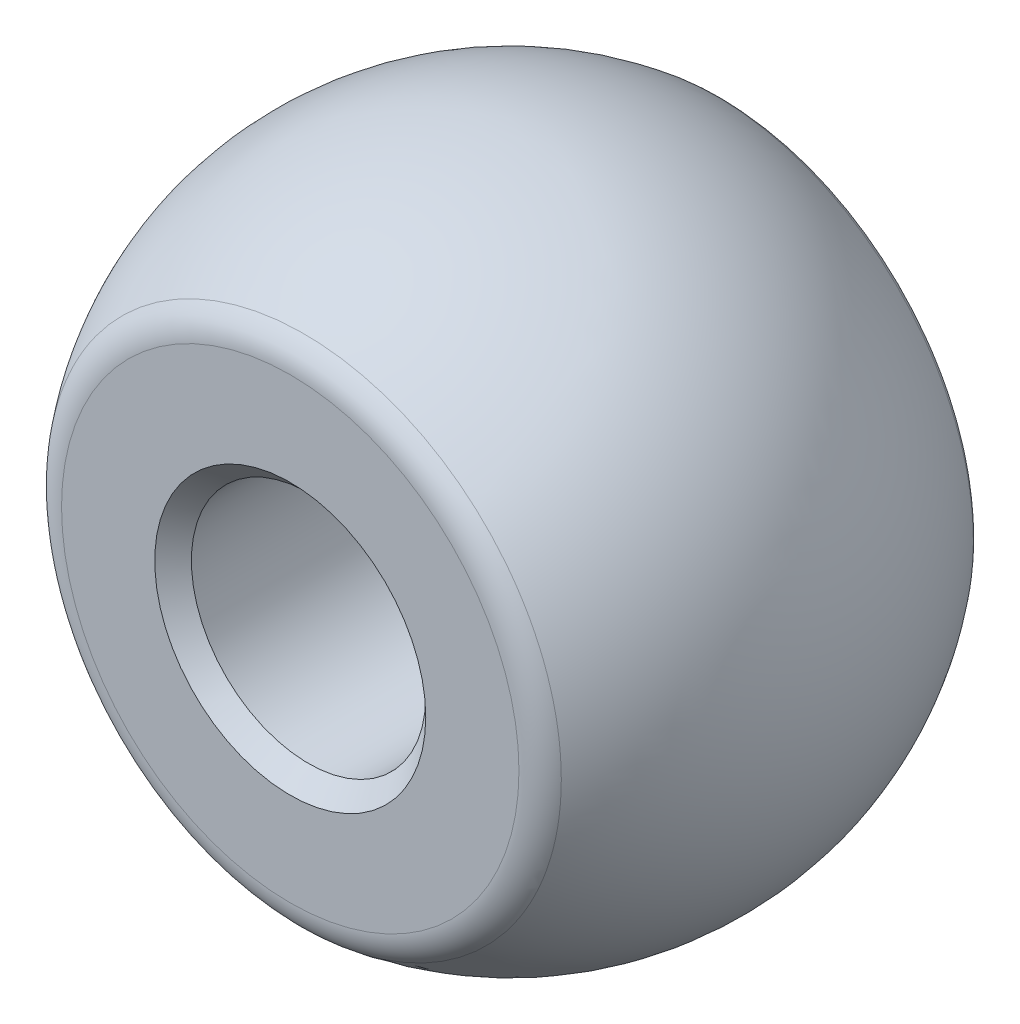
ISO-10303-21;
HEADER;
FILE_DESCRIPTION(('STEP AP214'),'2;1');
FILE_NAME('part.step','',(''),(''),'','','');
FILE_SCHEMA(('AUTOMOTIVE_DESIGN { 1 0 10303 214 1 1 1 1 }'));
ENDSEC;
DATA;
#1=APPLICATION_CONTEXT('core data for automotive mechanical design processes');
#2=APPLICATION_PROTOCOL_DEFINITION('international standard','automotive_design',2000,#1);
#3=PRODUCT_CONTEXT('',#1,'mechanical');
#4=PRODUCT('Part','Part','',(#3));
#5=PRODUCT_RELATED_PRODUCT_CATEGORY('part','',(#4));
#6=PRODUCT_DEFINITION_FORMATION('','',#4);
#7=PRODUCT_DEFINITION_CONTEXT('part definition',#1,'design');
#8=PRODUCT_DEFINITION('design','',#6,#7);
#9=PRODUCT_DEFINITION_SHAPE('','',#8);
#10=(LENGTH_UNIT() NAMED_UNIT(*) SI_UNIT(.MILLI.,.METRE.));
#11=(NAMED_UNIT(*) PLANE_ANGLE_UNIT() SI_UNIT($,.RADIAN.));
#12=(NAMED_UNIT(*) SI_UNIT($,.STERADIAN.) SOLID_ANGLE_UNIT());
#13=UNCERTAINTY_MEASURE_WITH_UNIT(LENGTH_MEASURE(1.E-05),#10,'distance_accuracy_value','');
#14=(GEOMETRIC_REPRESENTATION_CONTEXT(3) GLOBAL_UNCERTAINTY_ASSIGNED_CONTEXT((#13)) GLOBAL_UNIT_ASSIGNED_CONTEXT((#10,
#11,#12)) REPRESENTATION_CONTEXT('',''));
#15=CARTESIAN_POINT('',(0.,0.,0.));
#16=DIRECTION('',(0.,0.,1.));
#17=DIRECTION('',(1.,0.,0.));
#18=AXIS2_PLACEMENT_3D('',#15,#16,#17);
#19=CARTESIAN_POINT('',(0.,0.,-2.9999999999859));
#20=DIRECTION('',(0.,0.,-1.));
#21=DIRECTION('',(-1.,0.,0.));
#22=AXIS2_PLACEMENT_3D('',#19,#20,#21);
#23=CONICAL_SURFACE('',#22,1.84999999999036,0.785398163397448);
#24=CARTESIAN_POINT('',(0.,0.,-2.75));
#25=DIRECTION('',(0.,0.,1.));
#26=DIRECTION('',(1.,0.,0.));
#27=AXIS2_PLACEMENT_3D('',#24,#25,#26);
#28=CIRCLE('',#27,1.6);
#29=CARTESIAN_POINT('',(1.6,0.,-2.75));
#30=VERTEX_POINT('',#29);
#31=EDGE_CURVE('E145',#30,#30,#28,.T.);
#32=ORIENTED_EDGE('',*,*,#31,.T.);
#33=EDGE_LOOP('',(#32));
#34=FACE_BOUND('',#33,.T.);
#35=CARTESIAN_POINT('',(0.,0.,-2.9999999999859));
#36=DIRECTION('',(0.,0.,-1.));
#37=DIRECTION('',(-1.,0.,0.));
#38=AXIS2_PLACEMENT_3D('',#35,#36,#37);
#39=CIRCLE('',#38,1.84999999999036);
#40=CARTESIAN_POINT('',(-1.84999999999036,0.,-2.9999999999859));
#41=VERTEX_POINT('',#40);
#42=EDGE_CURVE('E144',#41,#41,#39,.F.);
#43=ORIENTED_EDGE('',*,*,#42,.F.);
#44=EDGE_LOOP('',(#43));
#45=FACE_BOUND('',#44,.T.);
#46=ADVANCED_FACE('F16',(#34,#45),#23,.F.);
#47=CARTESIAN_POINT('',(0.,0.,-4.5));
#48=DIRECTION('',(0.,0.,1.));
#49=DIRECTION('',(1.,0.,0.));
#50=AXIS2_PLACEMENT_3D('',#47,#48,#49);
#51=CYLINDRICAL_SURFACE('',#50,1.6);
#52=ORIENTED_EDGE('',*,*,#31,.F.);
#53=EDGE_LOOP('',(#52));
#54=FACE_BOUND('',#53,.T.);
#55=CARTESIAN_POINT('',(0.,0.,2.74999999999181));
#56=DIRECTION('',(0.,0.,1.));
#57=DIRECTION('',(1.,0.,0.));
#58=AXIS2_PLACEMENT_3D('',#55,#56,#57);
#59=CIRCLE('',#58,1.59999999999627);
#60=CARTESIAN_POINT('',(1.59999999999627,0.,2.74999999999181));
#61=VERTEX_POINT('',#60);
#62=EDGE_CURVE('E135',#61,#61,#59,.T.);
#63=ORIENTED_EDGE('',*,*,#62,.T.);
#64=EDGE_LOOP('',(#63));
#65=FACE_BOUND('',#64,.T.);
#66=ADVANCED_FACE('F119',(#54,#65),#51,.F.);
#67=CARTESIAN_POINT('',(0.,0.,-3.));
#68=DIRECTION('',(0.,0.,-1.));
#69=DIRECTION('',(-1.,0.,0.));
#70=AXIS2_PLACEMENT_3D('',#67,#68,#69);
#71=PLANE('',#70);
#72=ORIENTED_EDGE('',*,*,#42,.T.);
#73=EDGE_LOOP('',(#72));
#74=FACE_BOUND('',#73,.T.);
#75=CARTESIAN_POINT('',(0.,0.,-3.));
#76=DIRECTION('',(0.,0.,1.));
#77=DIRECTION('',(1.,0.,0.));
#78=AXIS2_PLACEMENT_3D('',#75,#76,#77);
#79=CIRCLE('',#78,3.1224989991992);
#80=CARTESIAN_POINT('',(3.1224989991992,0.,-3.));
#81=VERTEX_POINT('',#80);
#82=CARTESIAN_POINT('',(-3.1224989991992,0.,-3.));
#83=VERTEX_POINT('',#82);
#84=EDGE_CURVE('E104',#81,#83,#79,.T.);
#85=ORIENTED_EDGE('',*,*,#84,.F.);
#86=CARTESIAN_POINT('',(0.,0.,-3.));
#87=DIRECTION('',(0.,0.,1.));
#88=DIRECTION('',(-1.,0.,0.));
#89=AXIS2_PLACEMENT_3D('',#86,#87,#88);
#90=CIRCLE('',#89,3.1224989991992);
#91=EDGE_CURVE('E143',#83,#81,#90,.T.);
#92=ORIENTED_EDGE('',*,*,#91,.F.);
#93=EDGE_LOOP('',(#85,#92));
#94=FACE_BOUND('',#93,.T.);
#95=ADVANCED_FACE('F110',(#74,#94),#71,.T.);
#96=CARTESIAN_POINT('',(0.,0.,2.9999999999859));
#97=DIRECTION('',(0.,0.,1.));
#98=DIRECTION('',(1.,0.,0.));
#99=AXIS2_PLACEMENT_3D('',#96,#97,#98);
#100=CONICAL_SURFACE('',#99,1.8500000000472,0.785398163511135);
#101=ORIENTED_EDGE('',*,*,#62,.F.);
#102=EDGE_LOOP('',(#101));
#103=FACE_BOUND('',#102,.T.);
#104=CARTESIAN_POINT('',(0.,0.,2.9999999999859));
#105=DIRECTION('',(0.,0.,1.));
#106=DIRECTION('',(1.,0.,0.));
#107=AXIS2_PLACEMENT_3D('',#104,#105,#106);
#108=CIRCLE('',#107,1.8500000000472);
#109=CARTESIAN_POINT('',(1.8500000000472,0.,2.9999999999859));
#110=VERTEX_POINT('',#109);
#111=EDGE_CURVE('E150',#110,#110,#108,.F.);
#112=ORIENTED_EDGE('',*,*,#111,.F.);
#113=EDGE_LOOP('',(#112));
#114=FACE_BOUND('',#113,.T.);
#115=ADVANCED_FACE('F118',(#103,#114),#100,.F.);
#116=CARTESIAN_POINT('',(0.,0.,-2.5));
#117=DIRECTION('',(0.,0.,-1.));
#118=DIRECTION('',(-1.,0.,0.));
#119=AXIS2_PLACEMENT_3D('',#116,#117,#118);
#120=TOROIDAL_SURFACE('',#119,3.1224989991992,0.5);
#121=ORIENTED_EDGE('',*,*,#91,.T.);
#122=ORIENTED_EDGE('',*,*,#84,.T.);
#123=EDGE_LOOP('',(#121,#122));
#124=FACE_BOUND('',#123,.T.);
#125=CARTESIAN_POINT('',(0.,0.,-2.8125));
#126=DIRECTION('',(0.,0.,-1.));
#127=DIRECTION('',(-1.,0.,0.));
#128=AXIS2_PLACEMENT_3D('',#125,#126,#127);
#129=CIRCLE('',#128,3.5128113740991);
#130=CARTESIAN_POINT('',(-3.5128113740991,0.,-2.8125));
#131=VERTEX_POINT('',#130);
#132=EDGE_CURVE('E54',#131,#131,#129,.F.);
#133=ORIENTED_EDGE('',*,*,#132,.F.);
#134=EDGE_LOOP('',(#133));
#135=FACE_BOUND('',#134,.T.);
#136=ADVANCED_FACE('F75',(#124,#135),#120,.T.);
#137=CARTESIAN_POINT('',(0.,0.,3.));
#138=DIRECTION('',(0.,0.,1.));
#139=DIRECTION('',(1.,0.,0.));
#140=AXIS2_PLACEMENT_3D('',#137,#138,#139);
#141=PLANE('',#140);
#142=ORIENTED_EDGE('',*,*,#111,.T.);
#143=EDGE_LOOP('',(#142));
#144=FACE_BOUND('',#143,.T.);
#145=CARTESIAN_POINT('',(0.,0.,3.));
#146=DIRECTION('',(0.,0.,-1.));
#147=DIRECTION('',(-1.,0.,0.));
#148=AXIS2_PLACEMENT_3D('',#145,#146,#147);
#149=CIRCLE('',#148,3.1224989991992);
#150=CARTESIAN_POINT('',(-3.1224989991992,0.,3.));
#151=VERTEX_POINT('',#150);
#152=CARTESIAN_POINT('',(3.1224989991992,0.,3.));
#153=VERTEX_POINT('',#152);
#154=EDGE_CURVE('E27',#151,#153,#149,.T.);
#155=ORIENTED_EDGE('',*,*,#154,.F.);
#156=CARTESIAN_POINT('',(0.,0.,3.));
#157=DIRECTION('',(0.,0.,-1.));
#158=DIRECTION('',(1.,0.,0.));
#159=AXIS2_PLACEMENT_3D('',#156,#157,#158);
#160=CIRCLE('',#159,3.1224989991992);
#161=EDGE_CURVE('E46',#153,#151,#160,.T.);
#162=ORIENTED_EDGE('',*,*,#161,.F.);
#163=EDGE_LOOP('',(#155,#162));
#164=FACE_BOUND('',#163,.T.);
#165=ADVANCED_FACE('F58',(#144,#164),#141,.T.);
#166=CARTESIAN_POINT('',(0.,0.,2.5));
#167=DIRECTION('',(0.,0.,1.));
#168=DIRECTION('',(1.,0.,0.));
#169=AXIS2_PLACEMENT_3D('',#166,#167,#168);
#170=TOROIDAL_SURFACE('',#169,3.1224989991992,0.5);
#171=ORIENTED_EDGE('',*,*,#161,.T.);
#172=ORIENTED_EDGE('',*,*,#154,.T.);
#173=EDGE_LOOP('',(#171,#172));
#174=FACE_BOUND('',#173,.T.);
#175=CARTESIAN_POINT('',(0.,0.,2.8125));
#176=DIRECTION('',(0.,0.,1.));
#177=DIRECTION('',(1.,0.,0.));
#178=AXIS2_PLACEMENT_3D('',#175,#176,#177);
#179=CIRCLE('',#178,3.5128113740991);
#180=CARTESIAN_POINT('',(3.5128113740991,0.,2.8125));
#181=VERTEX_POINT('',#180);
#182=EDGE_CURVE('E11',#181,#181,#179,.F.);
#183=ORIENTED_EDGE('',*,*,#182,.F.);
#184=EDGE_LOOP('',(#183));
#185=FACE_BOUND('',#184,.T.);
#186=ADVANCED_FACE('F49',(#174,#185),#170,.T.);
#187=CARTESIAN_POINT('',(0.,0.,0.));
#188=DIRECTION('',(1.,0.,0.));
#189=DIRECTION('',(0.,-1.,0.));
#190=AXIS2_PLACEMENT_3D('',#187,#188,#189);
#191=SPHERICAL_SURFACE('',#190,4.5);
#192=CARTESIAN_POINT('',(-4.5,0.,0.));
#193=VERTEX_POINT('',#192);
#194=VERTEX_LOOP('',#193);
#195=FACE_BOUND('',#194,.T.);
#196=CARTESIAN_POINT('',(4.5,0.,0.));
#197=VERTEX_POINT('',#196);
#198=VERTEX_LOOP('',#197);
#199=FACE_BOUND('',#198,.T.);
#200=ORIENTED_EDGE('',*,*,#182,.T.);
#201=EDGE_LOOP('',(#200));
#202=FACE_BOUND('',#201,.T.);
#203=ORIENTED_EDGE('',*,*,#132,.T.);
#204=EDGE_LOOP('',(#203));
#205=FACE_BOUND('',#204,.T.);
#206=ADVANCED_FACE('F162',(#195,#199,#202,#205),#191,.T.);
#207=CLOSED_SHELL('',(#46,#66,#95,#115,#136,#165,#186,#206));
#208=MANIFOLD_SOLID_BREP('B1',#207);
#209=ADVANCED_BREP_SHAPE_REPRESENTATION('',(#18,#208),#14);
#210=SHAPE_DEFINITION_REPRESENTATION(#9,#209);
ENDSEC;
END-ISO-10303-21;
